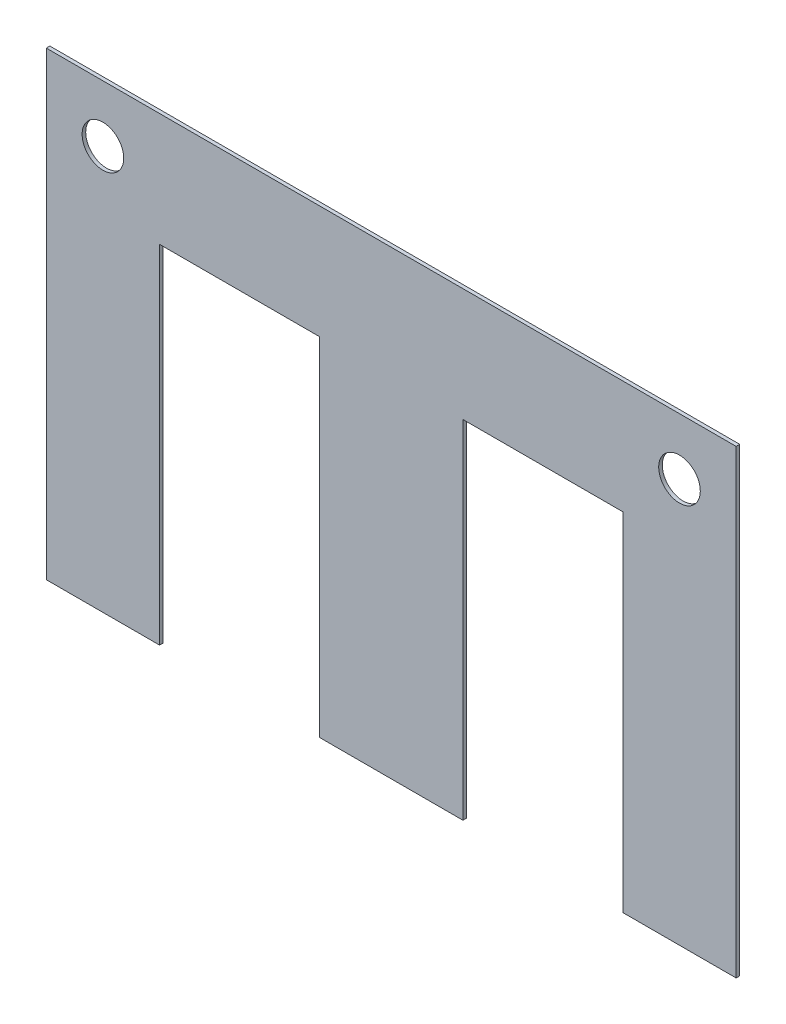
ISO-10303-21;
HEADER;
FILE_DESCRIPTION(('STEP AP214'),'2;1');
FILE_NAME('part.step','',(''),(''),'','','');
FILE_SCHEMA(('AUTOMOTIVE_DESIGN { 1 0 10303 214 1 1 1 1 }'));
ENDSEC;
DATA;
#1=APPLICATION_CONTEXT('core data for automotive mechanical design processes');
#2=APPLICATION_PROTOCOL_DEFINITION('international standard','automotive_design',2000,#1);
#3=PRODUCT_CONTEXT('',#1,'mechanical');
#4=PRODUCT('Part','Part','',(#3));
#5=PRODUCT_RELATED_PRODUCT_CATEGORY('part','',(#4));
#6=PRODUCT_DEFINITION_FORMATION('','',#4);
#7=PRODUCT_DEFINITION_CONTEXT('part definition',#1,'design');
#8=PRODUCT_DEFINITION('design','',#6,#7);
#9=PRODUCT_DEFINITION_SHAPE('','',#8);
#10=(LENGTH_UNIT() NAMED_UNIT(*) SI_UNIT(.MILLI.,.METRE.));
#11=(NAMED_UNIT(*) PLANE_ANGLE_UNIT() SI_UNIT($,.RADIAN.));
#12=(NAMED_UNIT(*) SI_UNIT($,.STERADIAN.) SOLID_ANGLE_UNIT());
#13=UNCERTAINTY_MEASURE_WITH_UNIT(LENGTH_MEASURE(1.E-05),#10,'distance_accuracy_value','');
#14=(GEOMETRIC_REPRESENTATION_CONTEXT(3) GLOBAL_UNCERTAINTY_ASSIGNED_CONTEXT((#13)) GLOBAL_UNIT_ASSIGNED_CONTEXT((#10,
#11,#12)) REPRESENTATION_CONTEXT('',''));
#15=CARTESIAN_POINT('',(0.,0.,0.));
#16=DIRECTION('',(0.,0.,1.));
#17=DIRECTION('',(1.,0.,0.));
#18=AXIS2_PLACEMENT_3D('',#15,#16,#17);
#19=CARTESIAN_POINT('',(0.,0.,0.25));
#20=DIRECTION('',(0.,0.,-1.));
#21=DIRECTION('',(-1.,0.,0.));
#22=AXIS2_PLACEMENT_3D('',#19,#20,#21);
#23=PLANE('',#22);
#24=DIRECTION('',(1.,0.,0.));
#25=VECTOR('',#24,1.);
#26=CARTESIAN_POINT('',(48.1,-32.1,0.25));
#27=LINE('',#26,#25);
#28=CARTESIAN_POINT('',(32.3,-32.1,0.25));
#29=VERTEX_POINT('',#28);
#30=CARTESIAN_POINT('',(48.1,-32.1,0.25));
#31=VERTEX_POINT('',#30);
#32=EDGE_CURVE('E177',#29,#31,#27,.T.);
#33=ORIENTED_EDGE('',*,*,#32,.T.);
#34=DIRECTION('',(0.,1.,0.));
#35=VECTOR('',#34,1.);
#36=CARTESIAN_POINT('',(48.1,32.1,0.25));
#37=LINE('',#36,#35);
#38=CARTESIAN_POINT('',(48.1,32.1,0.25));
#39=VERTEX_POINT('',#38);
#40=EDGE_CURVE('E105',#31,#39,#37,.T.);
#41=ORIENTED_EDGE('',*,*,#40,.T.);
#42=DIRECTION('',(-1.,0.,0.));
#43=VECTOR('',#42,1.);
#44=CARTESIAN_POINT('',(-48.1,32.1,0.25));
#45=LINE('',#44,#43);
#46=CARTESIAN_POINT('',(-48.1,32.1,0.25));
#47=VERTEX_POINT('',#46);
#48=EDGE_CURVE('E204',#39,#47,#45,.T.);
#49=ORIENTED_EDGE('',*,*,#48,.T.);
#50=DIRECTION('',(0.,-1.,0.));
#51=VECTOR('',#50,1.);
#52=CARTESIAN_POINT('',(-48.1,32.1,0.25));
#53=LINE('',#52,#51);
#54=CARTESIAN_POINT('',(-48.1,-32.1,0.25));
#55=VERTEX_POINT('',#54);
#56=EDGE_CURVE('E223',#47,#55,#53,.T.);
#57=ORIENTED_EDGE('',*,*,#56,.T.);
#58=DIRECTION('',(1.,0.,0.));
#59=VECTOR('',#58,1.);
#60=CARTESIAN_POINT('',(-48.1,-32.1,0.25));
#61=LINE('',#60,#59);
#62=CARTESIAN_POINT('',(-32.3,-32.1,0.25));
#63=VERTEX_POINT('',#62);
#64=EDGE_CURVE('E220',#55,#63,#61,.T.);
#65=ORIENTED_EDGE('',*,*,#64,.T.);
#66=DIRECTION('',(0.,1.,0.));
#67=VECTOR('',#66,1.);
#68=CARTESIAN_POINT('',(-32.3,-32.1,0.25));
#69=LINE('',#68,#67);
#70=CARTESIAN_POINT('',(-32.3,16.3,0.25));
#71=VERTEX_POINT('',#70);
#72=EDGE_CURVE('E222',#63,#71,#69,.T.);
#73=ORIENTED_EDGE('',*,*,#72,.T.);
#74=DIRECTION('',(1.,0.,0.));
#75=VECTOR('',#74,1.);
#76=CARTESIAN_POINT('',(-10.,16.3,0.25));
#77=LINE('',#76,#75);
#78=CARTESIAN_POINT('',(-10.,16.3,0.25));
#79=VERTEX_POINT('',#78);
#80=EDGE_CURVE('E225',#71,#79,#77,.T.);
#81=ORIENTED_EDGE('',*,*,#80,.T.);
#82=DIRECTION('',(0.,-1.,0.));
#83=VECTOR('',#82,1.);
#84=CARTESIAN_POINT('',(-10.,16.3,0.25));
#85=LINE('',#84,#83);
#86=CARTESIAN_POINT('',(-9.99999999999999,-32.1,0.25));
#87=VERTEX_POINT('',#86);
#88=EDGE_CURVE('E231',#79,#87,#85,.T.);
#89=ORIENTED_EDGE('',*,*,#88,.T.);
#90=DIRECTION('',(1.,0.,0.));
#91=VECTOR('',#90,1.);
#92=CARTESIAN_POINT('',(-9.99999999999999,-32.1,0.25));
#93=LINE('',#92,#91);
#94=CARTESIAN_POINT('',(10.,-32.1,0.25));
#95=VERTEX_POINT('',#94);
#96=EDGE_CURVE('E136',#87,#95,#93,.T.);
#97=ORIENTED_EDGE('',*,*,#96,.T.);
#98=DIRECTION('',(0.,1.,0.));
#99=VECTOR('',#98,1.);
#100=CARTESIAN_POINT('',(10.,16.3,0.25));
#101=LINE('',#100,#99);
#102=CARTESIAN_POINT('',(10.,16.3,0.25));
#103=VERTEX_POINT('',#102);
#104=EDGE_CURVE('E130',#95,#103,#101,.T.);
#105=ORIENTED_EDGE('',*,*,#104,.T.);
#106=DIRECTION('',(1.,0.,0.));
#107=VECTOR('',#106,1.);
#108=CARTESIAN_POINT('',(32.3,16.3,0.25));
#109=LINE('',#108,#107);
#110=CARTESIAN_POINT('',(32.3,16.3,0.25));
#111=VERTEX_POINT('',#110);
#112=EDGE_CURVE('E134',#103,#111,#109,.T.);
#113=ORIENTED_EDGE('',*,*,#112,.T.);
#114=DIRECTION('',(0.,-1.,0.));
#115=VECTOR('',#114,1.);
#116=CARTESIAN_POINT('',(32.3,-32.1,0.25));
#117=LINE('',#116,#115);
#118=EDGE_CURVE('E50',#111,#29,#117,.T.);
#119=ORIENTED_EDGE('',*,*,#118,.T.);
#120=EDGE_LOOP('',(#33,#41,#49,#57,#65,#73,#81,#89,#97,#105,#113,#119));
#121=FACE_BOUND('',#120,.T.);
#122=CARTESIAN_POINT('',(40.2,24.2,0.25));
#123=DIRECTION('',(0.,0.,1.));
#124=DIRECTION('',(1.,0.,0.));
#125=AXIS2_PLACEMENT_3D('',#122,#123,#124);
#126=CIRCLE('',#125,2.9);
#127=CARTESIAN_POINT('',(43.1,24.2,0.25));
#128=VERTEX_POINT('',#127);
#129=EDGE_CURVE('E158',#128,#128,#126,.T.);
#130=ORIENTED_EDGE('',*,*,#129,.F.);
#131=EDGE_LOOP('',(#130));
#132=FACE_BOUND('',#131,.T.);
#133=CARTESIAN_POINT('',(-40.2,24.2,0.25));
#134=DIRECTION('',(0.,0.,1.));
#135=DIRECTION('',(-1.,0.,0.));
#136=AXIS2_PLACEMENT_3D('',#133,#134,#135);
#137=CIRCLE('',#136,2.90000000000001);
#138=CARTESIAN_POINT('',(-43.1,24.2,0.25));
#139=VERTEX_POINT('',#138);
#140=EDGE_CURVE('E272',#139,#139,#137,.T.);
#141=ORIENTED_EDGE('',*,*,#140,.F.);
#142=EDGE_LOOP('',(#141));
#143=FACE_BOUND('',#142,.T.);
#144=ADVANCED_FACE('F33',(#121,#132,#143),#23,.F.);
#145=CARTESIAN_POINT('',(0.,0.,-0.25));
#146=DIRECTION('',(0.,0.,-1.));
#147=DIRECTION('',(-1.,0.,0.));
#148=AXIS2_PLACEMENT_3D('',#145,#146,#147);
#149=PLANE('',#148);
#150=CARTESIAN_POINT('',(40.2,24.2,-0.25));
#151=DIRECTION('',(0.,0.,1.));
#152=DIRECTION('',(1.,0.,0.));
#153=AXIS2_PLACEMENT_3D('',#150,#151,#152);
#154=CIRCLE('',#153,2.9);
#155=CARTESIAN_POINT('',(43.1,24.2,-0.25));
#156=VERTEX_POINT('',#155);
#157=EDGE_CURVE('E277',#156,#156,#154,.T.);
#158=ORIENTED_EDGE('',*,*,#157,.T.);
#159=EDGE_LOOP('',(#158));
#160=FACE_BOUND('',#159,.T.);
#161=DIRECTION('',(1.,0.,0.));
#162=VECTOR('',#161,1.);
#163=CARTESIAN_POINT('',(48.1,-32.1,-0.25));
#164=LINE('',#163,#162);
#165=CARTESIAN_POINT('',(32.3,-32.1,-0.25));
#166=VERTEX_POINT('',#165);
#167=CARTESIAN_POINT('',(48.1,-32.1,-0.25));
#168=VERTEX_POINT('',#167);
#169=EDGE_CURVE('E154',#166,#168,#164,.T.);
#170=ORIENTED_EDGE('',*,*,#169,.F.);
#171=DIRECTION('',(0.,-1.,0.));
#172=VECTOR('',#171,1.);
#173=CARTESIAN_POINT('',(32.3,-32.1,-0.25));
#174=LINE('',#173,#172);
#175=CARTESIAN_POINT('',(32.3,16.3,-0.25));
#176=VERTEX_POINT('',#175);
#177=EDGE_CURVE('E97',#176,#166,#174,.T.);
#178=ORIENTED_EDGE('',*,*,#177,.F.);
#179=DIRECTION('',(1.,0.,0.));
#180=VECTOR('',#179,1.);
#181=CARTESIAN_POINT('',(32.3,16.3,-0.25));
#182=LINE('',#181,#180);
#183=CARTESIAN_POINT('',(10.,16.3,-0.25));
#184=VERTEX_POINT('',#183);
#185=EDGE_CURVE('E91',#184,#176,#182,.T.);
#186=ORIENTED_EDGE('',*,*,#185,.F.);
#187=DIRECTION('',(0.,1.,0.));
#188=VECTOR('',#187,1.);
#189=CARTESIAN_POINT('',(10.,16.3,-0.25));
#190=LINE('',#189,#188);
#191=CARTESIAN_POINT('',(10.,-32.1,-0.25));
#192=VERTEX_POINT('',#191);
#193=EDGE_CURVE('E144',#192,#184,#190,.T.);
#194=ORIENTED_EDGE('',*,*,#193,.F.);
#195=DIRECTION('',(1.,0.,0.));
#196=VECTOR('',#195,1.);
#197=CARTESIAN_POINT('',(-9.99999999999999,-32.1,-0.25));
#198=LINE('',#197,#196);
#199=CARTESIAN_POINT('',(-9.99999999999999,-32.1,-0.25));
#200=VERTEX_POINT('',#199);
#201=EDGE_CURVE('E172',#200,#192,#198,.T.);
#202=ORIENTED_EDGE('',*,*,#201,.F.);
#203=DIRECTION('',(0.,-1.,0.));
#204=VECTOR('',#203,1.);
#205=CARTESIAN_POINT('',(-10.,16.3,-0.25));
#206=LINE('',#205,#204);
#207=CARTESIAN_POINT('',(-10.,16.3,-0.25));
#208=VERTEX_POINT('',#207);
#209=EDGE_CURVE('E170',#208,#200,#206,.T.);
#210=ORIENTED_EDGE('',*,*,#209,.F.);
#211=DIRECTION('',(1.,0.,0.));
#212=VECTOR('',#211,1.);
#213=CARTESIAN_POINT('',(-10.,16.3,-0.25));
#214=LINE('',#213,#212);
#215=CARTESIAN_POINT('',(-32.3,16.3,-0.25));
#216=VERTEX_POINT('',#215);
#217=EDGE_CURVE('E168',#216,#208,#214,.T.);
#218=ORIENTED_EDGE('',*,*,#217,.F.);
#219=DIRECTION('',(0.,1.,0.));
#220=VECTOR('',#219,1.);
#221=CARTESIAN_POINT('',(-32.3,-32.1,-0.25));
#222=LINE('',#221,#220);
#223=CARTESIAN_POINT('',(-32.3,-32.1,-0.25));
#224=VERTEX_POINT('',#223);
#225=EDGE_CURVE('E166',#224,#216,#222,.T.);
#226=ORIENTED_EDGE('',*,*,#225,.F.);
#227=DIRECTION('',(1.,0.,0.));
#228=VECTOR('',#227,1.);
#229=CARTESIAN_POINT('',(-48.1,-32.1,-0.25));
#230=LINE('',#229,#228);
#231=CARTESIAN_POINT('',(-48.1,-32.1,-0.25));
#232=VERTEX_POINT('',#231);
#233=EDGE_CURVE('E164',#232,#224,#230,.T.);
#234=ORIENTED_EDGE('',*,*,#233,.F.);
#235=DIRECTION('',(0.,-1.,0.));
#236=VECTOR('',#235,1.);
#237=CARTESIAN_POINT('',(-48.1,32.1,-0.25));
#238=LINE('',#237,#236);
#239=CARTESIAN_POINT('',(-48.1,32.1,-0.25));
#240=VERTEX_POINT('',#239);
#241=EDGE_CURVE('E162',#240,#232,#238,.T.);
#242=ORIENTED_EDGE('',*,*,#241,.F.);
#243=DIRECTION('',(-1.,0.,0.));
#244=VECTOR('',#243,1.);
#245=CARTESIAN_POINT('',(-48.1,32.1,-0.25));
#246=LINE('',#245,#244);
#247=CARTESIAN_POINT('',(48.1,32.1,-0.25));
#248=VERTEX_POINT('',#247);
#249=EDGE_CURVE('E160',#248,#240,#246,.T.);
#250=ORIENTED_EDGE('',*,*,#249,.F.);
#251=DIRECTION('',(0.,1.,0.));
#252=VECTOR('',#251,1.);
#253=CARTESIAN_POINT('',(48.1,32.1,-0.25));
#254=LINE('',#253,#252);
#255=EDGE_CURVE('E157',#168,#248,#254,.T.);
#256=ORIENTED_EDGE('',*,*,#255,.F.);
#257=EDGE_LOOP('',(#170,#178,#186,#194,#202,#210,#218,#226,#234,#242,#250,#256));
#258=FACE_BOUND('',#257,.T.);
#259=CARTESIAN_POINT('',(-40.2,24.2,-0.25));
#260=DIRECTION('',(0.,0.,1.));
#261=DIRECTION('',(-1.,0.,0.));
#262=AXIS2_PLACEMENT_3D('',#259,#260,#261);
#263=CIRCLE('',#262,2.90000000000001);
#264=CARTESIAN_POINT('',(-43.1,24.2,-0.25));
#265=VERTEX_POINT('',#264);
#266=EDGE_CURVE('E275',#265,#265,#263,.T.);
#267=ORIENTED_EDGE('',*,*,#266,.T.);
#268=EDGE_LOOP('',(#267));
#269=FACE_BOUND('',#268,.T.);
#270=ADVANCED_FACE('F208',(#160,#258,#269),#149,.T.);
#271=CARTESIAN_POINT('',(48.1,-32.1,0.25));
#272=DIRECTION('',(0.,1.,0.));
#273=DIRECTION('',(0.,0.,1.));
#274=AXIS2_PLACEMENT_3D('',#271,#272,#273);
#275=PLANE('',#274);
#276=ORIENTED_EDGE('',*,*,#169,.T.);
#277=DIRECTION('',(0.,0.,-1.));
#278=VECTOR('',#277,1.);
#279=CARTESIAN_POINT('',(48.1,-32.1,0.25));
#280=LINE('',#279,#278);
#281=EDGE_CURVE('E11',#31,#168,#280,.T.);
#282=ORIENTED_EDGE('',*,*,#281,.F.);
#283=ORIENTED_EDGE('',*,*,#32,.F.);
#284=DIRECTION('',(0.,0.,-1.));
#285=VECTOR('',#284,1.);
#286=CARTESIAN_POINT('',(32.3,-32.1,0.25));
#287=LINE('',#286,#285);
#288=EDGE_CURVE('E150',#29,#166,#287,.T.);
#289=ORIENTED_EDGE('',*,*,#288,.T.);
#290=EDGE_LOOP('',(#276,#282,#283,#289));
#291=FACE_BOUND('',#290,.T.);
#292=ADVANCED_FACE('F35',(#291),#275,.F.);
#293=CARTESIAN_POINT('',(48.1,32.1,0.25));
#294=DIRECTION('',(-1.,0.,0.));
#295=DIRECTION('',(0.,0.,1.));
#296=AXIS2_PLACEMENT_3D('',#293,#294,#295);
#297=PLANE('',#296);
#298=ORIENTED_EDGE('',*,*,#255,.T.);
#299=DIRECTION('',(0.,0.,-1.));
#300=VECTOR('',#299,1.);
#301=CARTESIAN_POINT('',(48.1,32.1,0.25));
#302=LINE('',#301,#300);
#303=EDGE_CURVE('E42',#39,#248,#302,.T.);
#304=ORIENTED_EDGE('',*,*,#303,.F.);
#305=ORIENTED_EDGE('',*,*,#40,.F.);
#306=ORIENTED_EDGE('',*,*,#281,.T.);
#307=EDGE_LOOP('',(#298,#304,#305,#306));
#308=FACE_BOUND('',#307,.T.);
#309=ADVANCED_FACE('F372',(#308),#297,.F.);
#310=CARTESIAN_POINT('',(-48.1,32.1,0.25));
#311=DIRECTION('',(0.,-1.,0.));
#312=DIRECTION('',(1.,0.,0.));
#313=AXIS2_PLACEMENT_3D('',#310,#311,#312);
#314=PLANE('',#313);
#315=ORIENTED_EDGE('',*,*,#249,.T.);
#316=DIRECTION('',(0.,0.,-1.));
#317=VECTOR('',#316,1.);
#318=CARTESIAN_POINT('',(-48.1,32.1,0.25));
#319=LINE('',#318,#317);
#320=EDGE_CURVE('E196',#47,#240,#319,.T.);
#321=ORIENTED_EDGE('',*,*,#320,.F.);
#322=ORIENTED_EDGE('',*,*,#48,.F.);
#323=ORIENTED_EDGE('',*,*,#303,.T.);
#324=EDGE_LOOP('',(#315,#321,#322,#323));
#325=FACE_BOUND('',#324,.T.);
#326=ADVANCED_FACE('F202',(#325),#314,.F.);
#327=CARTESIAN_POINT('',(-48.1,32.1,0.25));
#328=DIRECTION('',(1.,0.,0.));
#329=DIRECTION('',(0.,1.,0.));
#330=AXIS2_PLACEMENT_3D('',#327,#328,#329);
#331=PLANE('',#330);
#332=ORIENTED_EDGE('',*,*,#241,.T.);
#333=DIRECTION('',(0.,0.,-1.));
#334=VECTOR('',#333,1.);
#335=CARTESIAN_POINT('',(-48.1,-32.1,0.25));
#336=LINE('',#335,#334);
#337=EDGE_CURVE('E193',#55,#232,#336,.T.);
#338=ORIENTED_EDGE('',*,*,#337,.F.);
#339=ORIENTED_EDGE('',*,*,#56,.F.);
#340=ORIENTED_EDGE('',*,*,#320,.T.);
#341=EDGE_LOOP('',(#332,#338,#339,#340));
#342=FACE_BOUND('',#341,.T.);
#343=ADVANCED_FACE('F214',(#342),#331,.F.);
#344=CARTESIAN_POINT('',(-48.1,-32.1,0.25));
#345=DIRECTION('',(0.,1.,0.));
#346=DIRECTION('',(-1.,0.,0.));
#347=AXIS2_PLACEMENT_3D('',#344,#345,#346);
#348=PLANE('',#347);
#349=ORIENTED_EDGE('',*,*,#233,.T.);
#350=DIRECTION('',(0.,0.,-1.));
#351=VECTOR('',#350,1.);
#352=CARTESIAN_POINT('',(-32.3,-32.1,0.25));
#353=LINE('',#352,#351);
#354=EDGE_CURVE('E190',#63,#224,#353,.T.);
#355=ORIENTED_EDGE('',*,*,#354,.F.);
#356=ORIENTED_EDGE('',*,*,#64,.F.);
#357=ORIENTED_EDGE('',*,*,#337,.T.);
#358=EDGE_LOOP('',(#349,#355,#356,#357));
#359=FACE_BOUND('',#358,.T.);
#360=ADVANCED_FACE('F218',(#359),#348,.F.);
#361=CARTESIAN_POINT('',(-32.3,-32.1,0.25));
#362=DIRECTION('',(-1.,0.,0.));
#363=DIRECTION('',(0.,-1.,0.));
#364=AXIS2_PLACEMENT_3D('',#361,#362,#363);
#365=PLANE('',#364);
#366=ORIENTED_EDGE('',*,*,#225,.T.);
#367=DIRECTION('',(0.,0.,-1.));
#368=VECTOR('',#367,1.);
#369=CARTESIAN_POINT('',(-32.3,16.3,0.25));
#370=LINE('',#369,#368);
#371=EDGE_CURVE('E187',#71,#216,#370,.T.);
#372=ORIENTED_EDGE('',*,*,#371,.F.);
#373=ORIENTED_EDGE('',*,*,#72,.F.);
#374=ORIENTED_EDGE('',*,*,#354,.T.);
#375=EDGE_LOOP('',(#366,#372,#373,#374));
#376=FACE_BOUND('',#375,.T.);
#377=ADVANCED_FACE('F337',(#376),#365,.F.);
#378=CARTESIAN_POINT('',(-10.,16.3,0.25));
#379=DIRECTION('',(0.,1.,0.));
#380=DIRECTION('',(-1.,0.,0.));
#381=AXIS2_PLACEMENT_3D('',#378,#379,#380);
#382=PLANE('',#381);
#383=ORIENTED_EDGE('',*,*,#217,.T.);
#384=DIRECTION('',(0.,0.,-1.));
#385=VECTOR('',#384,1.);
#386=CARTESIAN_POINT('',(-10.,16.3,0.25));
#387=LINE('',#386,#385);
#388=EDGE_CURVE('E184',#79,#208,#387,.T.);
#389=ORIENTED_EDGE('',*,*,#388,.F.);
#390=ORIENTED_EDGE('',*,*,#80,.F.);
#391=ORIENTED_EDGE('',*,*,#371,.T.);
#392=EDGE_LOOP('',(#383,#389,#390,#391));
#393=FACE_BOUND('',#392,.T.);
#394=ADVANCED_FACE('F328',(#393),#382,.F.);
#395=CARTESIAN_POINT('',(-10.,16.3,0.25));
#396=DIRECTION('',(1.,0.,0.));
#397=DIRECTION('',(0.,1.,0.));
#398=AXIS2_PLACEMENT_3D('',#395,#396,#397);
#399=PLANE('',#398);
#400=ORIENTED_EDGE('',*,*,#209,.T.);
#401=DIRECTION('',(0.,0.,-1.));
#402=VECTOR('',#401,1.);
#403=CARTESIAN_POINT('',(-9.99999999999999,-32.1,0.25));
#404=LINE('',#403,#402);
#405=EDGE_CURVE('E181',#87,#200,#404,.T.);
#406=ORIENTED_EDGE('',*,*,#405,.F.);
#407=ORIENTED_EDGE('',*,*,#88,.F.);
#408=ORIENTED_EDGE('',*,*,#388,.T.);
#409=EDGE_LOOP('',(#400,#406,#407,#408));
#410=FACE_BOUND('',#409,.T.);
#411=ADVANCED_FACE('F237',(#410),#399,.F.);
#412=CARTESIAN_POINT('',(-9.99999999999999,-32.1,0.25));
#413=DIRECTION('',(0.,1.,0.));
#414=DIRECTION('',(-1.,0.,0.));
#415=AXIS2_PLACEMENT_3D('',#412,#413,#414);
#416=PLANE('',#415);
#417=ORIENTED_EDGE('',*,*,#201,.T.);
#418=DIRECTION('',(0.,0.,-1.));
#419=VECTOR('',#418,1.);
#420=CARTESIAN_POINT('',(10.,-32.1,0.25));
#421=LINE('',#420,#419);
#422=EDGE_CURVE('E145',#95,#192,#421,.T.);
#423=ORIENTED_EDGE('',*,*,#422,.F.);
#424=ORIENTED_EDGE('',*,*,#96,.F.);
#425=ORIENTED_EDGE('',*,*,#405,.T.);
#426=EDGE_LOOP('',(#417,#423,#424,#425));
#427=FACE_BOUND('',#426,.T.);
#428=ADVANCED_FACE('F241',(#427),#416,.F.);
#429=CARTESIAN_POINT('',(10.,16.3,0.25));
#430=DIRECTION('',(-1.,0.,0.));
#431=DIRECTION('',(0.,0.,1.));
#432=AXIS2_PLACEMENT_3D('',#429,#430,#431);
#433=PLANE('',#432);
#434=ORIENTED_EDGE('',*,*,#193,.T.);
#435=DIRECTION('',(0.,0.,-1.));
#436=VECTOR('',#435,1.);
#437=CARTESIAN_POINT('',(10.,16.3,0.25));
#438=LINE('',#437,#436);
#439=EDGE_CURVE('E141',#103,#184,#438,.T.);
#440=ORIENTED_EDGE('',*,*,#439,.F.);
#441=ORIENTED_EDGE('',*,*,#104,.F.);
#442=ORIENTED_EDGE('',*,*,#422,.T.);
#443=EDGE_LOOP('',(#434,#440,#441,#442));
#444=FACE_BOUND('',#443,.T.);
#445=ADVANCED_FACE('F142',(#444),#433,.F.);
#446=CARTESIAN_POINT('',(32.3,16.3,0.25));
#447=DIRECTION('',(0.,1.,0.));
#448=DIRECTION('',(-1.,0.,0.));
#449=AXIS2_PLACEMENT_3D('',#446,#447,#448);
#450=PLANE('',#449);
#451=ORIENTED_EDGE('',*,*,#185,.T.);
#452=DIRECTION('',(0.,0.,-1.));
#453=VECTOR('',#452,1.);
#454=CARTESIAN_POINT('',(32.3,16.3,0.25));
#455=LINE('',#454,#453);
#456=EDGE_CURVE('E146',#111,#176,#455,.T.);
#457=ORIENTED_EDGE('',*,*,#456,.F.);
#458=ORIENTED_EDGE('',*,*,#112,.F.);
#459=ORIENTED_EDGE('',*,*,#439,.T.);
#460=EDGE_LOOP('',(#451,#457,#458,#459));
#461=FACE_BOUND('',#460,.T.);
#462=ADVANCED_FACE('F148',(#461),#450,.F.);
#463=CARTESIAN_POINT('',(32.3,-32.1,0.25));
#464=DIRECTION('',(1.,0.,0.));
#465=DIRECTION('',(0.,1.,0.));
#466=AXIS2_PLACEMENT_3D('',#463,#464,#465);
#467=PLANE('',#466);
#468=ORIENTED_EDGE('',*,*,#177,.T.);
#469=ORIENTED_EDGE('',*,*,#288,.F.);
#470=ORIENTED_EDGE('',*,*,#118,.F.);
#471=ORIENTED_EDGE('',*,*,#456,.T.);
#472=EDGE_LOOP('',(#468,#469,#470,#471));
#473=FACE_BOUND('',#472,.T.);
#474=ADVANCED_FACE('F245',(#473),#467,.F.);
#475=CARTESIAN_POINT('',(40.2,24.2,0.25));
#476=DIRECTION('',(0.,0.,-1.));
#477=DIRECTION('',(-1.,0.,0.));
#478=AXIS2_PLACEMENT_3D('',#475,#476,#477);
#479=CYLINDRICAL_SURFACE('',#478,2.9);
#480=ORIENTED_EDGE('',*,*,#129,.T.);
#481=EDGE_LOOP('',(#480));
#482=FACE_BOUND('',#481,.T.);
#483=ORIENTED_EDGE('',*,*,#157,.F.);
#484=EDGE_LOOP('',(#483));
#485=FACE_BOUND('',#484,.T.);
#486=ADVANCED_FACE('F247',(#482,#485),#479,.F.);
#487=CARTESIAN_POINT('',(-40.2,24.2,0.25));
#488=DIRECTION('',(0.,0.,-1.));
#489=DIRECTION('',(-1.,0.,0.));
#490=AXIS2_PLACEMENT_3D('',#487,#488,#489);
#491=CYLINDRICAL_SURFACE('',#490,2.90000000000001);
#492=ORIENTED_EDGE('',*,*,#140,.T.);
#493=EDGE_LOOP('',(#492));
#494=FACE_BOUND('',#493,.T.);
#495=ORIENTED_EDGE('',*,*,#266,.F.);
#496=EDGE_LOOP('',(#495));
#497=FACE_BOUND('',#496,.T.);
#498=ADVANCED_FACE('F253',(#494,#497),#491,.F.);
#499=CLOSED_SHELL('',(#144,#270,#292,#309,#326,#343,#360,#377,#394,#411,#428,#445,#462,#474,
#486,#498));
#500=MANIFOLD_SOLID_BREP('B2',#499);
#501=ADVANCED_BREP_SHAPE_REPRESENTATION('',(#18,#500),#14);
#502=SHAPE_DEFINITION_REPRESENTATION(#9,#501);
ENDSEC;
END-ISO-10303-21;
